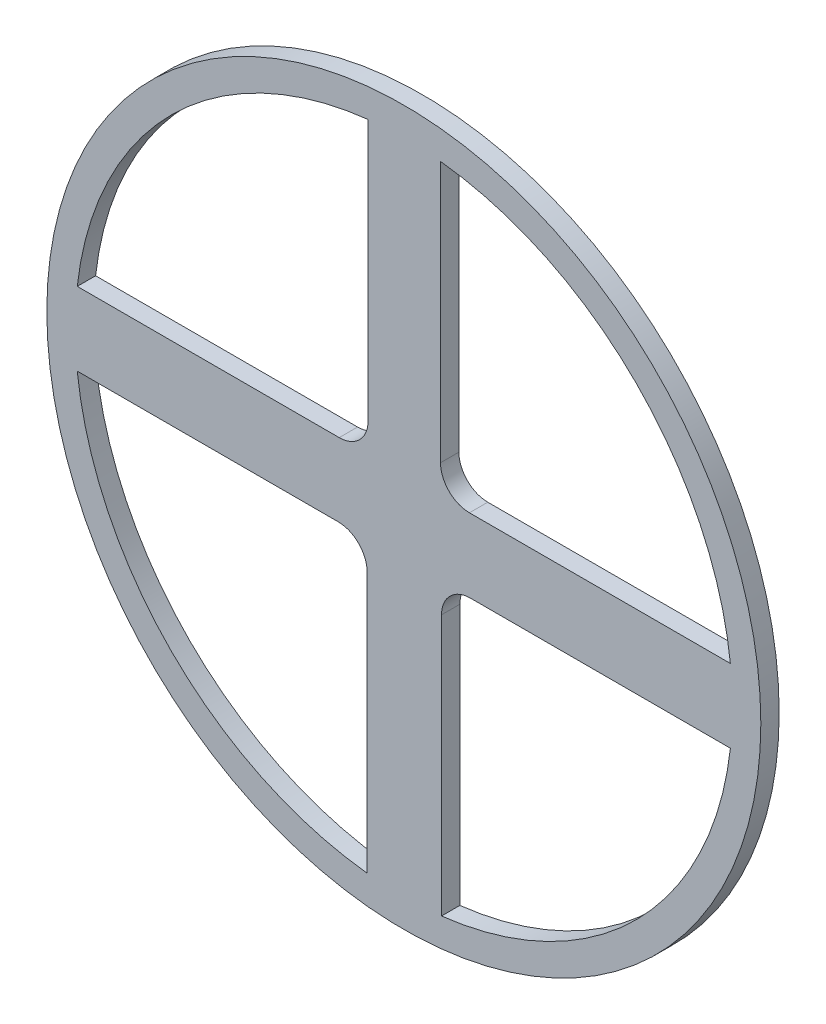
ISO-10303-21;
HEADER;
FILE_DESCRIPTION(('STEP AP214'),'2;1');
FILE_NAME('part.step','',(''),(''),'','','');
FILE_SCHEMA(('AUTOMOTIVE_DESIGN { 1 0 10303 214 1 1 1 1 }'));
ENDSEC;
DATA;
#1=APPLICATION_CONTEXT('core data for automotive mechanical design processes');
#2=APPLICATION_PROTOCOL_DEFINITION('international standard','automotive_design',2000,#1);
#3=PRODUCT_CONTEXT('',#1,'mechanical');
#4=PRODUCT('Part','Part','',(#3));
#5=PRODUCT_RELATED_PRODUCT_CATEGORY('part','',(#4));
#6=PRODUCT_DEFINITION_FORMATION('','',#4);
#7=PRODUCT_DEFINITION_CONTEXT('part definition',#1,'design');
#8=PRODUCT_DEFINITION('design','',#6,#7);
#9=PRODUCT_DEFINITION_SHAPE('','',#8);
#10=(LENGTH_UNIT() NAMED_UNIT(*) SI_UNIT(.MILLI.,.METRE.));
#11=(NAMED_UNIT(*) PLANE_ANGLE_UNIT() SI_UNIT($,.RADIAN.));
#12=(NAMED_UNIT(*) SI_UNIT($,.STERADIAN.) SOLID_ANGLE_UNIT());
#13=UNCERTAINTY_MEASURE_WITH_UNIT(LENGTH_MEASURE(1.E-05),#10,'distance_accuracy_value','');
#14=(GEOMETRIC_REPRESENTATION_CONTEXT(3) GLOBAL_UNCERTAINTY_ASSIGNED_CONTEXT((#13)) GLOBAL_UNIT_ASSIGNED_CONTEXT((#10,
#11,#12)) REPRESENTATION_CONTEXT('',''));
#15=CARTESIAN_POINT('',(0.,0.,0.));
#16=DIRECTION('',(0.,0.,1.));
#17=DIRECTION('',(1.,0.,0.));
#18=AXIS2_PLACEMENT_3D('',#15,#16,#17);
#19=CARTESIAN_POINT('',(0.,-12.7,6.35));
#20=DIRECTION('',(0.,1.,0.));
#21=DIRECTION('',(-1.,0.,0.));
#22=AXIS2_PLACEMENT_3D('',#19,#20,#21);
#23=PLANE('',#22);
#24=DIRECTION('',(1.,0.,0.));
#25=VECTOR('',#24,1.);
#26=CARTESIAN_POINT('',(0.,-12.7,0.));
#27=LINE('',#26,#25);
#28=CARTESIAN_POINT('',(23.0444472963723,-12.7,0.));
#29=VERTEX_POINT('',#28);
#30=CARTESIAN_POINT('',(112.9985579554,-12.7,0.));
#31=VERTEX_POINT('',#30);
#32=EDGE_CURVE('E223',#29,#31,#27,.T.);
#33=ORIENTED_EDGE('',*,*,#32,.T.);
#34=DIRECTION('',(0.,0.,-1.));
#35=VECTOR('',#34,1.);
#36=CARTESIAN_POINT('',(112.9985579554,-12.7,6.35));
#37=LINE('',#36,#35);
#38=CARTESIAN_POINT('',(112.9985579554,-12.7,6.35));
#39=VERTEX_POINT('',#38);
#40=EDGE_CURVE('E11',#39,#31,#37,.T.);
#41=ORIENTED_EDGE('',*,*,#40,.F.);
#42=DIRECTION('',(1.,0.,0.));
#43=VECTOR('',#42,1.);
#44=CARTESIAN_POINT('',(0.,-12.7,6.35));
#45=LINE('',#44,#43);
#46=CARTESIAN_POINT('',(23.0444472963723,-12.7,6.35));
#47=VERTEX_POINT('',#46);
#48=EDGE_CURVE('E177',#47,#39,#45,.T.);
#49=ORIENTED_EDGE('',*,*,#48,.F.);
#50=DIRECTION('',(0.,0.,-1.));
#51=VECTOR('',#50,1.);
#52=CARTESIAN_POINT('',(23.0444472963723,-12.7,6.35));
#53=LINE('',#52,#51);
#54=EDGE_CURVE('E232',#47,#29,#53,.T.);
#55=ORIENTED_EDGE('',*,*,#54,.T.);
#56=EDGE_LOOP('',(#33,#41,#49,#55));
#57=FACE_BOUND('',#56,.T.);
#58=ADVANCED_FACE('F43',(#57),#23,.F.);
#59=CARTESIAN_POINT('',(0.,0.,6.35));
#60=DIRECTION('',(0.,0.,-1.));
#61=DIRECTION('',(-1.,0.,0.));
#62=AXIS2_PLACEMENT_3D('',#59,#60,#61);
#63=CYLINDRICAL_SURFACE('',#62,113.71);
#64=CARTESIAN_POINT('',(0.,0.,0.));
#65=DIRECTION('',(0.,0.,1.));
#66=DIRECTION('',(1.,0.,0.));
#67=AXIS2_PLACEMENT_3D('',#64,#65,#66);
#68=CIRCLE('',#67,113.71);
#69=CARTESIAN_POINT('',(13.0444472963723,-112.959313448392,0.));
#70=VERTEX_POINT('',#69);
#71=EDGE_CURVE('E167',#70,#31,#68,.T.);
#72=ORIENTED_EDGE('',*,*,#71,.F.);
#73=DIRECTION('',(0.,0.,-1.));
#74=VECTOR('',#73,1.);
#75=CARTESIAN_POINT('',(13.0444472963723,-112.959313448392,6.35));
#76=LINE('',#75,#74);
#77=CARTESIAN_POINT('',(13.0444472963723,-112.959313448392,6.35));
#78=VERTEX_POINT('',#77);
#79=EDGE_CURVE('E53',#78,#70,#76,.T.);
#80=ORIENTED_EDGE('',*,*,#79,.F.);
#81=CARTESIAN_POINT('',(0.,0.,6.35));
#82=DIRECTION('',(0.,0.,1.));
#83=DIRECTION('',(1.,0.,0.));
#84=AXIS2_PLACEMENT_3D('',#81,#82,#83);
#85=CIRCLE('',#84,113.71);
#86=EDGE_CURVE('E165',#78,#39,#85,.T.);
#87=ORIENTED_EDGE('',*,*,#86,.T.);
#88=ORIENTED_EDGE('',*,*,#40,.T.);
#89=EDGE_LOOP('',(#72,#80,#87,#88));
#90=FACE_BOUND('',#89,.T.);
#91=ADVANCED_FACE('F164',(#90),#63,.F.);
#92=CARTESIAN_POINT('',(13.0444472963723,0.,6.35));
#93=DIRECTION('',(1.,0.,0.));
#94=DIRECTION('',(0.,1.,0.));
#95=AXIS2_PLACEMENT_3D('',#92,#93,#94);
#96=PLANE('',#95);
#97=DIRECTION('',(0.,-1.,0.));
#98=VECTOR('',#97,1.);
#99=CARTESIAN_POINT('',(13.0444472963723,0.,0.));
#100=LINE('',#99,#98);
#101=CARTESIAN_POINT('',(13.0444472963723,-22.7,0.));
#102=VERTEX_POINT('',#101);
#103=EDGE_CURVE('E226',#102,#70,#100,.T.);
#104=ORIENTED_EDGE('',*,*,#103,.F.);
#105=DIRECTION('',(0.,0.,-1.));
#106=VECTOR('',#105,1.);
#107=CARTESIAN_POINT('',(13.0444472963723,-22.7,6.35));
#108=LINE('',#107,#106);
#109=CARTESIAN_POINT('',(13.0444472963723,-22.7,6.35));
#110=VERTEX_POINT('',#109);
#111=EDGE_CURVE('E113',#110,#102,#108,.T.);
#112=ORIENTED_EDGE('',*,*,#111,.F.);
#113=DIRECTION('',(0.,-1.,0.));
#114=VECTOR('',#113,1.);
#115=CARTESIAN_POINT('',(13.0444472963723,0.,6.35));
#116=LINE('',#115,#114);
#117=EDGE_CURVE('E175',#110,#78,#116,.T.);
#118=ORIENTED_EDGE('',*,*,#117,.T.);
#119=ORIENTED_EDGE('',*,*,#79,.T.);
#120=EDGE_LOOP('',(#104,#112,#118,#119));
#121=FACE_BOUND('',#120,.T.);
#122=ADVANCED_FACE('F182',(#121),#96,.T.);
#123=CARTESIAN_POINT('',(-112.9985579554,-12.7,0.));
#124=VERTEX_POINT('',#123);
#125=CARTESIAN_POINT('',(-12.7,-112.9985579554,0.));
#126=VERTEX_POINT('',#125);
#127=EDGE_CURVE('E213',#124,#126,#68,.T.);
#128=ORIENTED_EDGE('',*,*,#127,.F.);
#129=DIRECTION('',(0.,0.,-1.));
#130=VECTOR('',#129,1.);
#131=CARTESIAN_POINT('',(-112.9985579554,-12.7,6.35));
#132=LINE('',#131,#130);
#133=CARTESIAN_POINT('',(-112.9985579554,-12.7,6.35));
#134=VERTEX_POINT('',#133);
#135=EDGE_CURVE('E234',#134,#124,#132,.T.);
#136=ORIENTED_EDGE('',*,*,#135,.F.);
#137=CARTESIAN_POINT('',(-12.7,-112.9985579554,6.35));
#138=VERTEX_POINT('',#137);
#139=EDGE_CURVE('E180',#134,#138,#85,.T.);
#140=ORIENTED_EDGE('',*,*,#139,.T.);
#141=DIRECTION('',(0.,0.,-1.));
#142=VECTOR('',#141,1.);
#143=CARTESIAN_POINT('',(-12.7,-112.9985579554,6.35));
#144=LINE('',#143,#142);
#145=EDGE_CURVE('E236',#138,#126,#144,.T.);
#146=ORIENTED_EDGE('',*,*,#145,.T.);
#147=EDGE_LOOP('',(#128,#136,#140,#146));
#148=FACE_BOUND('',#147,.T.);
#149=ADVANCED_FACE('F308',(#148),#63,.F.);
#150=CARTESIAN_POINT('',(0.,-12.7,6.35));
#151=DIRECTION('',(0.,1.,0.));
#152=DIRECTION('',(0.,0.,1.));
#153=AXIS2_PLACEMENT_3D('',#150,#151,#152);
#154=PLANE('',#153);
#155=DIRECTION('',(1.,0.,0.));
#156=VECTOR('',#155,1.);
#157=CARTESIAN_POINT('',(0.,-12.7,0.));
#158=LINE('',#157,#156);
#159=CARTESIAN_POINT('',(-22.7000000000001,-12.7,0.));
#160=VERTEX_POINT('',#159);
#161=EDGE_CURVE('E214',#124,#160,#158,.T.);
#162=ORIENTED_EDGE('',*,*,#161,.T.);
#163=DIRECTION('',(0.,0.,-1.));
#164=VECTOR('',#163,1.);
#165=CARTESIAN_POINT('',(-22.7000000000001,-12.7,6.35));
#166=LINE('',#165,#164);
#167=CARTESIAN_POINT('',(-22.7000000000001,-12.7,6.35));
#168=VERTEX_POINT('',#167);
#169=EDGE_CURVE('E241',#168,#160,#166,.T.);
#170=ORIENTED_EDGE('',*,*,#169,.F.);
#171=DIRECTION('',(1.,0.,0.));
#172=VECTOR('',#171,1.);
#173=CARTESIAN_POINT('',(0.,-12.7,6.35));
#174=LINE('',#173,#172);
#175=EDGE_CURVE('E291',#134,#168,#174,.T.);
#176=ORIENTED_EDGE('',*,*,#175,.F.);
#177=ORIENTED_EDGE('',*,*,#135,.T.);
#178=EDGE_LOOP('',(#162,#170,#176,#177));
#179=FACE_BOUND('',#178,.T.);
#180=ADVANCED_FACE('F358',(#179),#154,.F.);
#181=CARTESIAN_POINT('',(-22.7,-22.7,6.35));
#182=DIRECTION('',(0.,0.,-1.));
#183=DIRECTION('',(-1.,0.,0.));
#184=AXIS2_PLACEMENT_3D('',#181,#182,#183);
#185=CYLINDRICAL_SURFACE('',#184,10.);
#186=CARTESIAN_POINT('',(-22.7,-22.7,0.));
#187=DIRECTION('',(0.,0.,1.));
#188=DIRECTION('',(1.,0.,0.));
#189=AXIS2_PLACEMENT_3D('',#186,#187,#188);
#190=CIRCLE('',#189,10.);
#191=CARTESIAN_POINT('',(-12.7,-22.7000000000001,0.));
#192=VERTEX_POINT('',#191);
#193=EDGE_CURVE('E217',#192,#160,#190,.T.);
#194=ORIENTED_EDGE('',*,*,#193,.F.);
#195=DIRECTION('',(0.,0.,-1.));
#196=VECTOR('',#195,1.);
#197=CARTESIAN_POINT('',(-12.7,-22.7000000000001,6.35));
#198=LINE('',#197,#196);
#199=CARTESIAN_POINT('',(-12.7,-22.7000000000001,6.35));
#200=VERTEX_POINT('',#199);
#201=EDGE_CURVE('E238',#200,#192,#198,.T.);
#202=ORIENTED_EDGE('',*,*,#201,.F.);
#203=CARTESIAN_POINT('',(-22.7,-22.7,6.35));
#204=DIRECTION('',(0.,0.,1.));
#205=DIRECTION('',(1.,0.,0.));
#206=AXIS2_PLACEMENT_3D('',#203,#204,#205);
#207=CIRCLE('',#206,10.);
#208=EDGE_CURVE('E293',#200,#168,#207,.T.);
#209=ORIENTED_EDGE('',*,*,#208,.T.);
#210=ORIENTED_EDGE('',*,*,#169,.T.);
#211=EDGE_LOOP('',(#194,#202,#209,#210));
#212=FACE_BOUND('',#211,.T.);
#213=ADVANCED_FACE('F355',(#212),#185,.F.);
#214=CARTESIAN_POINT('',(-12.3555527036276,113.03673923724,0.));
#215=VERTEX_POINT('',#214);
#216=CARTESIAN_POINT('',(-112.9985579554,12.7,0.));
#217=VERTEX_POINT('',#216);
#218=EDGE_CURVE('E196',#215,#217,#68,.T.);
#219=ORIENTED_EDGE('',*,*,#218,.F.);
#220=DIRECTION('',(0.,0.,-1.));
#221=VECTOR('',#220,1.);
#222=CARTESIAN_POINT('',(-12.3555527036276,113.03673923724,6.35));
#223=LINE('',#222,#221);
#224=CARTESIAN_POINT('',(-12.3555527036276,113.03673923724,6.35));
#225=VERTEX_POINT('',#224);
#226=EDGE_CURVE('E239',#225,#215,#223,.T.);
#227=ORIENTED_EDGE('',*,*,#226,.F.);
#228=CARTESIAN_POINT('',(-112.9985579554,12.7,6.35));
#229=VERTEX_POINT('',#228);
#230=EDGE_CURVE('E276',#225,#229,#85,.T.);
#231=ORIENTED_EDGE('',*,*,#230,.T.);
#232=DIRECTION('',(0.,0.,-1.));
#233=VECTOR('',#232,1.);
#234=CARTESIAN_POINT('',(-112.9985579554,12.7,6.35));
#235=LINE('',#234,#233);
#236=EDGE_CURVE('E244',#229,#217,#235,.T.);
#237=ORIENTED_EDGE('',*,*,#236,.T.);
#238=EDGE_LOOP('',(#219,#227,#231,#237));
#239=FACE_BOUND('',#238,.T.);
#240=ADVANCED_FACE('F331',(#239),#63,.F.);
#241=CARTESIAN_POINT('',(-12.3555527036276,0.,6.35));
#242=DIRECTION('',(-1.,0.,0.));
#243=DIRECTION('',(0.,-1.,0.));
#244=AXIS2_PLACEMENT_3D('',#241,#242,#243);
#245=PLANE('',#244);
#246=DIRECTION('',(0.,1.,0.));
#247=VECTOR('',#246,1.);
#248=CARTESIAN_POINT('',(-12.3555527036276,0.,0.));
#249=LINE('',#248,#247);
#250=CARTESIAN_POINT('',(-12.3555527036276,22.7,0.));
#251=VERTEX_POINT('',#250);
#252=EDGE_CURVE('E204',#251,#215,#249,.T.);
#253=ORIENTED_EDGE('',*,*,#252,.F.);
#254=DIRECTION('',(0.,0.,-1.));
#255=VECTOR('',#254,1.);
#256=CARTESIAN_POINT('',(-12.3555527036276,22.7,6.35));
#257=LINE('',#256,#255);
#258=CARTESIAN_POINT('',(-12.3555527036276,22.7,6.35));
#259=VERTEX_POINT('',#258);
#260=EDGE_CURVE('E248',#259,#251,#257,.T.);
#261=ORIENTED_EDGE('',*,*,#260,.F.);
#262=DIRECTION('',(0.,1.,0.));
#263=VECTOR('',#262,1.);
#264=CARTESIAN_POINT('',(-12.3555527036276,0.,6.35));
#265=LINE('',#264,#263);
#266=EDGE_CURVE('E280',#259,#225,#265,.T.);
#267=ORIENTED_EDGE('',*,*,#266,.T.);
#268=ORIENTED_EDGE('',*,*,#226,.T.);
#269=EDGE_LOOP('',(#253,#261,#267,#268));
#270=FACE_BOUND('',#269,.T.);
#271=ADVANCED_FACE('F320',(#270),#245,.T.);
#272=CARTESIAN_POINT('',(-22.3555527036277,22.7,6.35));
#273=DIRECTION('',(0.,0.,-1.));
#274=DIRECTION('',(-1.,0.,0.));
#275=AXIS2_PLACEMENT_3D('',#272,#273,#274);
#276=CYLINDRICAL_SURFACE('',#275,10.);
#277=CARTESIAN_POINT('',(-22.3555527036277,22.7,0.));
#278=DIRECTION('',(0.,0.,1.));
#279=DIRECTION('',(1.,0.,0.));
#280=AXIS2_PLACEMENT_3D('',#277,#278,#279);
#281=CIRCLE('',#280,10.);
#282=CARTESIAN_POINT('',(-22.3555527036277,12.7,0.));
#283=VERTEX_POINT('',#282);
#284=EDGE_CURVE('E207',#251,#283,#281,.F.);
#285=ORIENTED_EDGE('',*,*,#284,.T.);
#286=DIRECTION('',(0.,0.,-1.));
#287=VECTOR('',#286,1.);
#288=CARTESIAN_POINT('',(-22.3555527036277,12.7,6.35));
#289=LINE('',#288,#287);
#290=CARTESIAN_POINT('',(-22.3555527036277,12.7,6.35));
#291=VERTEX_POINT('',#290);
#292=EDGE_CURVE('E246',#291,#283,#289,.T.);
#293=ORIENTED_EDGE('',*,*,#292,.F.);
#294=CARTESIAN_POINT('',(-22.3555527036277,22.7,6.35));
#295=DIRECTION('',(0.,0.,1.));
#296=DIRECTION('',(1.,0.,0.));
#297=AXIS2_PLACEMENT_3D('',#294,#295,#296);
#298=CIRCLE('',#297,10.);
#299=EDGE_CURVE('E286',#259,#291,#298,.F.);
#300=ORIENTED_EDGE('',*,*,#299,.F.);
#301=ORIENTED_EDGE('',*,*,#260,.T.);
#302=EDGE_LOOP('',(#285,#293,#300,#301));
#303=FACE_BOUND('',#302,.T.);
#304=ADVANCED_FACE('F326',(#303),#276,.F.);
#305=CARTESIAN_POINT('',(112.9985579554,12.7,0.));
#306=VERTEX_POINT('',#305);
#307=CARTESIAN_POINT('',(12.7,112.9985579554,0.));
#308=VERTEX_POINT('',#307);
#309=EDGE_CURVE('E192',#306,#308,#68,.T.);
#310=ORIENTED_EDGE('',*,*,#309,.F.);
#311=DIRECTION('',(0.,0.,-1.));
#312=VECTOR('',#311,1.);
#313=CARTESIAN_POINT('',(112.9985579554,12.7,6.35));
#314=LINE('',#313,#312);
#315=CARTESIAN_POINT('',(112.9985579554,12.7,6.35));
#316=VERTEX_POINT('',#315);
#317=EDGE_CURVE('E47',#316,#306,#314,.T.);
#318=ORIENTED_EDGE('',*,*,#317,.F.);
#319=CARTESIAN_POINT('',(12.7,112.9985579554,6.35));
#320=VERTEX_POINT('',#319);
#321=EDGE_CURVE('E181',#316,#320,#85,.T.);
#322=ORIENTED_EDGE('',*,*,#321,.T.);
#323=DIRECTION('',(0.,0.,-1.));
#324=VECTOR('',#323,1.);
#325=CARTESIAN_POINT('',(12.7,112.9985579554,6.35));
#326=LINE('',#325,#324);
#327=EDGE_CURVE('E191',#320,#308,#326,.T.);
#328=ORIENTED_EDGE('',*,*,#327,.T.);
#329=EDGE_LOOP('',(#310,#318,#322,#328));
#330=FACE_BOUND('',#329,.T.);
#331=ADVANCED_FACE('F263',(#330),#63,.F.);
#332=CARTESIAN_POINT('',(0.,12.7,6.35));
#333=DIRECTION('',(0.,1.,0.));
#334=DIRECTION('',(-1.,0.,0.));
#335=AXIS2_PLACEMENT_3D('',#332,#333,#334);
#336=PLANE('',#335);
#337=DIRECTION('',(1.,0.,0.));
#338=VECTOR('',#337,1.);
#339=CARTESIAN_POINT('',(0.,12.7,0.));
#340=LINE('',#339,#338);
#341=CARTESIAN_POINT('',(22.7000000000001,12.7,0.));
#342=VERTEX_POINT('',#341);
#343=EDGE_CURVE('E195',#342,#306,#340,.T.);
#344=ORIENTED_EDGE('',*,*,#343,.F.);
#345=DIRECTION('',(0.,0.,-1.));
#346=VECTOR('',#345,1.);
#347=CARTESIAN_POINT('',(22.7000000000001,12.7,6.35));
#348=LINE('',#347,#346);
#349=CARTESIAN_POINT('',(22.7000000000001,12.7,6.35));
#350=VERTEX_POINT('',#349);
#351=EDGE_CURVE('E254',#350,#342,#348,.T.);
#352=ORIENTED_EDGE('',*,*,#351,.F.);
#353=DIRECTION('',(1.,0.,0.));
#354=VECTOR('',#353,1.);
#355=CARTESIAN_POINT('',(0.,12.7,6.35));
#356=LINE('',#355,#354);
#357=EDGE_CURVE('E262',#350,#316,#356,.T.);
#358=ORIENTED_EDGE('',*,*,#357,.T.);
#359=ORIENTED_EDGE('',*,*,#317,.T.);
#360=EDGE_LOOP('',(#344,#352,#358,#359));
#361=FACE_BOUND('',#360,.T.);
#362=ADVANCED_FACE('F45',(#361),#336,.T.);
#363=CARTESIAN_POINT('',(22.7,22.7,6.35));
#364=DIRECTION('',(0.,0.,-1.));
#365=DIRECTION('',(-1.,0.,0.));
#366=AXIS2_PLACEMENT_3D('',#363,#364,#365);
#367=CYLINDRICAL_SURFACE('',#366,10.);
#368=CARTESIAN_POINT('',(22.7,22.7,0.));
#369=DIRECTION('',(0.,0.,1.));
#370=DIRECTION('',(1.,0.,0.));
#371=AXIS2_PLACEMENT_3D('',#368,#369,#370);
#372=CIRCLE('',#371,10.);
#373=CARTESIAN_POINT('',(12.7,22.7000000000001,0.));
#374=VERTEX_POINT('',#373);
#375=EDGE_CURVE('E199',#342,#374,#372,.F.);
#376=ORIENTED_EDGE('',*,*,#375,.T.);
#377=DIRECTION('',(0.,0.,-1.));
#378=VECTOR('',#377,1.);
#379=CARTESIAN_POINT('',(12.7,22.7000000000001,6.35));
#380=LINE('',#379,#378);
#381=CARTESIAN_POINT('',(12.7,22.7000000000001,6.35));
#382=VERTEX_POINT('',#381);
#383=EDGE_CURVE('E252',#382,#374,#380,.T.);
#384=ORIENTED_EDGE('',*,*,#383,.F.);
#385=CARTESIAN_POINT('',(22.7,22.7,6.35));
#386=DIRECTION('',(0.,0.,1.));
#387=DIRECTION('',(1.,0.,0.));
#388=AXIS2_PLACEMENT_3D('',#385,#386,#387);
#389=CIRCLE('',#388,10.);
#390=EDGE_CURVE('E277',#350,#382,#389,.F.);
#391=ORIENTED_EDGE('',*,*,#390,.F.);
#392=ORIENTED_EDGE('',*,*,#351,.T.);
#393=EDGE_LOOP('',(#376,#384,#391,#392));
#394=FACE_BOUND('',#393,.T.);
#395=ADVANCED_FACE('F270',(#394),#367,.F.);
#396=CARTESIAN_POINT('',(23.0444472963723,-22.7,6.35));
#397=DIRECTION('',(0.,0.,-1.));
#398=DIRECTION('',(-1.,0.,0.));
#399=AXIS2_PLACEMENT_3D('',#396,#397,#398);
#400=CYLINDRICAL_SURFACE('',#399,10.);
#401=CARTESIAN_POINT('',(23.0444472963723,-22.7,0.));
#402=DIRECTION('',(0.,0.,1.));
#403=DIRECTION('',(1.,0.,0.));
#404=AXIS2_PLACEMENT_3D('',#401,#402,#403);
#405=CIRCLE('',#404,10.);
#406=EDGE_CURVE('E116',#102,#29,#405,.F.);
#407=ORIENTED_EDGE('',*,*,#406,.T.);
#408=ORIENTED_EDGE('',*,*,#54,.F.);
#409=CARTESIAN_POINT('',(23.0444472963723,-22.7,6.35));
#410=DIRECTION('',(0.,0.,1.));
#411=DIRECTION('',(1.,0.,0.));
#412=AXIS2_PLACEMENT_3D('',#409,#410,#411);
#413=CIRCLE('',#412,10.);
#414=EDGE_CURVE('E62',#110,#47,#413,.F.);
#415=ORIENTED_EDGE('',*,*,#414,.F.);
#416=ORIENTED_EDGE('',*,*,#111,.T.);
#417=EDGE_LOOP('',(#407,#408,#415,#416));
#418=FACE_BOUND('',#417,.T.);
#419=ADVANCED_FACE('F338',(#418),#400,.F.);
#420=CARTESIAN_POINT('',(-12.7,0.,6.35));
#421=DIRECTION('',(1.,0.,0.));
#422=DIRECTION('',(0.,1.,0.));
#423=AXIS2_PLACEMENT_3D('',#420,#421,#422);
#424=PLANE('',#423);
#425=DIRECTION('',(0.,-1.,0.));
#426=VECTOR('',#425,1.);
#427=CARTESIAN_POINT('',(-12.7,0.,0.));
#428=LINE('',#427,#426);
#429=EDGE_CURVE('E220',#192,#126,#428,.T.);
#430=ORIENTED_EDGE('',*,*,#429,.T.);
#431=ORIENTED_EDGE('',*,*,#145,.F.);
#432=DIRECTION('',(0.,-1.,0.));
#433=VECTOR('',#432,1.);
#434=CARTESIAN_POINT('',(-12.7,0.,6.35));
#435=LINE('',#434,#433);
#436=EDGE_CURVE('E295',#200,#138,#435,.T.);
#437=ORIENTED_EDGE('',*,*,#436,.F.);
#438=ORIENTED_EDGE('',*,*,#201,.T.);
#439=EDGE_LOOP('',(#430,#431,#437,#438));
#440=FACE_BOUND('',#439,.T.);
#441=ADVANCED_FACE('F303',(#440),#424,.F.);
#442=CARTESIAN_POINT('',(0.,12.7,6.35));
#443=DIRECTION('',(0.,1.,0.));
#444=DIRECTION('',(-1.,0.,0.));
#445=AXIS2_PLACEMENT_3D('',#442,#443,#444);
#446=PLANE('',#445);
#447=DIRECTION('',(1.,0.,0.));
#448=VECTOR('',#447,1.);
#449=CARTESIAN_POINT('',(0.,12.7,0.));
#450=LINE('',#449,#448);
#451=EDGE_CURVE('E210',#217,#283,#450,.T.);
#452=ORIENTED_EDGE('',*,*,#451,.F.);
#453=ORIENTED_EDGE('',*,*,#236,.F.);
#454=DIRECTION('',(1.,0.,0.));
#455=VECTOR('',#454,1.);
#456=CARTESIAN_POINT('',(0.,12.7,6.35));
#457=LINE('',#456,#455);
#458=EDGE_CURVE('E288',#229,#291,#457,.T.);
#459=ORIENTED_EDGE('',*,*,#458,.T.);
#460=ORIENTED_EDGE('',*,*,#292,.T.);
#461=EDGE_LOOP('',(#452,#453,#459,#460));
#462=FACE_BOUND('',#461,.T.);
#463=ADVANCED_FACE('F329',(#462),#446,.T.);
#464=CARTESIAN_POINT('',(12.7,0.,6.35));
#465=DIRECTION('',(-1.,0.,0.));
#466=DIRECTION('',(0.,0.,1.));
#467=AXIS2_PLACEMENT_3D('',#464,#465,#466);
#468=PLANE('',#467);
#469=DIRECTION('',(0.,1.,0.));
#470=VECTOR('',#469,1.);
#471=CARTESIAN_POINT('',(12.7,0.,0.));
#472=LINE('',#471,#470);
#473=EDGE_CURVE('E201',#374,#308,#472,.T.);
#474=ORIENTED_EDGE('',*,*,#473,.T.);
#475=ORIENTED_EDGE('',*,*,#327,.F.);
#476=DIRECTION('',(0.,1.,0.));
#477=VECTOR('',#476,1.);
#478=CARTESIAN_POINT('',(12.7,0.,6.35));
#479=LINE('',#478,#477);
#480=EDGE_CURVE('E274',#382,#320,#479,.T.);
#481=ORIENTED_EDGE('',*,*,#480,.F.);
#482=ORIENTED_EDGE('',*,*,#383,.T.);
#483=EDGE_LOOP('',(#474,#475,#481,#482));
#484=FACE_BOUND('',#483,.T.);
#485=ADVANCED_FACE('F273',(#484),#468,.F.);
#486=CARTESIAN_POINT('',(0.,0.,6.35));
#487=DIRECTION('',(0.,0.,-1.));
#488=DIRECTION('',(-1.,0.,0.));
#489=AXIS2_PLACEMENT_3D('',#486,#487,#488);
#490=CYLINDRICAL_SURFACE('',#489,123.5325);
#491=CARTESIAN_POINT('',(0.,0.,6.35));
#492=DIRECTION('',(0.,0.,1.));
#493=DIRECTION('',(1.,0.,0.));
#494=AXIS2_PLACEMENT_3D('',#491,#492,#493);
#495=CIRCLE('',#494,123.5325);
#496=CARTESIAN_POINT('',(123.5325,0.,6.35));
#497=VERTEX_POINT('',#496);
#498=EDGE_CURVE('E184',#497,#497,#495,.T.);
#499=ORIENTED_EDGE('',*,*,#498,.F.);
#500=EDGE_LOOP('',(#499));
#501=FACE_BOUND('',#500,.T.);
#502=CARTESIAN_POINT('',(0.,0.,0.));
#503=DIRECTION('',(0.,0.,1.));
#504=DIRECTION('',(1.,0.,0.));
#505=AXIS2_PLACEMENT_3D('',#502,#503,#504);
#506=CIRCLE('',#505,123.5325);
#507=CARTESIAN_POINT('',(123.5325,0.,0.));
#508=VERTEX_POINT('',#507);
#509=EDGE_CURVE('E229',#508,#508,#506,.T.);
#510=ORIENTED_EDGE('',*,*,#509,.T.);
#511=EDGE_LOOP('',(#510));
#512=FACE_BOUND('',#511,.T.);
#513=ADVANCED_FACE('F312',(#501,#512),#490,.T.);
#514=CARTESIAN_POINT('',(0.,0.,6.35));
#515=DIRECTION('',(0.,0.,1.));
#516=DIRECTION('',(1.,0.,0.));
#517=AXIS2_PLACEMENT_3D('',#514,#515,#516);
#518=PLANE('',#517);
#519=ORIENTED_EDGE('',*,*,#321,.F.);
#520=ORIENTED_EDGE('',*,*,#357,.F.);
#521=ORIENTED_EDGE('',*,*,#390,.T.);
#522=ORIENTED_EDGE('',*,*,#480,.T.);
#523=EDGE_LOOP('',(#519,#520,#521,#522));
#524=FACE_BOUND('',#523,.T.);
#525=ORIENTED_EDGE('',*,*,#230,.F.);
#526=ORIENTED_EDGE('',*,*,#266,.F.);
#527=ORIENTED_EDGE('',*,*,#299,.T.);
#528=ORIENTED_EDGE('',*,*,#458,.F.);
#529=EDGE_LOOP('',(#525,#526,#527,#528));
#530=FACE_BOUND('',#529,.T.);
#531=ORIENTED_EDGE('',*,*,#139,.F.);
#532=ORIENTED_EDGE('',*,*,#175,.T.);
#533=ORIENTED_EDGE('',*,*,#208,.F.);
#534=ORIENTED_EDGE('',*,*,#436,.T.);
#535=EDGE_LOOP('',(#531,#532,#533,#534));
#536=FACE_BOUND('',#535,.T.);
#537=ORIENTED_EDGE('',*,*,#48,.T.);
#538=ORIENTED_EDGE('',*,*,#86,.F.);
#539=ORIENTED_EDGE('',*,*,#117,.F.);
#540=ORIENTED_EDGE('',*,*,#414,.T.);
#541=EDGE_LOOP('',(#537,#538,#539,#540));
#542=FACE_BOUND('',#541,.T.);
#543=ORIENTED_EDGE('',*,*,#498,.T.);
#544=EDGE_LOOP('',(#543));
#545=FACE_BOUND('',#544,.T.);
#546=ADVANCED_FACE('F173',(#524,#530,#536,#542,#545),#518,.T.);
#547=CARTESIAN_POINT('',(0.,0.,0.));
#548=DIRECTION('',(0.,0.,1.));
#549=DIRECTION('',(1.,0.,0.));
#550=AXIS2_PLACEMENT_3D('',#547,#548,#549);
#551=PLANE('',#550);
#552=ORIENTED_EDGE('',*,*,#309,.T.);
#553=ORIENTED_EDGE('',*,*,#473,.F.);
#554=ORIENTED_EDGE('',*,*,#375,.F.);
#555=ORIENTED_EDGE('',*,*,#343,.T.);
#556=EDGE_LOOP('',(#552,#553,#554,#555));
#557=FACE_BOUND('',#556,.T.);
#558=ORIENTED_EDGE('',*,*,#218,.T.);
#559=ORIENTED_EDGE('',*,*,#451,.T.);
#560=ORIENTED_EDGE('',*,*,#284,.F.);
#561=ORIENTED_EDGE('',*,*,#252,.T.);
#562=EDGE_LOOP('',(#558,#559,#560,#561));
#563=FACE_BOUND('',#562,.T.);
#564=ORIENTED_EDGE('',*,*,#127,.T.);
#565=ORIENTED_EDGE('',*,*,#429,.F.);
#566=ORIENTED_EDGE('',*,*,#193,.T.);
#567=ORIENTED_EDGE('',*,*,#161,.F.);
#568=EDGE_LOOP('',(#564,#565,#566,#567));
#569=FACE_BOUND('',#568,.T.);
#570=ORIENTED_EDGE('',*,*,#32,.F.);
#571=ORIENTED_EDGE('',*,*,#406,.F.);
#572=ORIENTED_EDGE('',*,*,#103,.T.);
#573=ORIENTED_EDGE('',*,*,#71,.T.);
#574=EDGE_LOOP('',(#570,#571,#572,#573));
#575=FACE_BOUND('',#574,.T.);
#576=ORIENTED_EDGE('',*,*,#509,.F.);
#577=EDGE_LOOP('',(#576));
#578=FACE_BOUND('',#577,.T.);
#579=ADVANCED_FACE('F267',(#557,#563,#569,#575,#578),#551,.F.);
#580=CLOSED_SHELL('',(#58,#91,#122,#149,#180,#213,#240,#271,#304,#331,#362,#395,#419,#441,#463,
#485,#513,#546,#579));
#581=MANIFOLD_SOLID_BREP('B2',#580);
#582=ADVANCED_BREP_SHAPE_REPRESENTATION('',(#18,#581),#14);
#583=SHAPE_DEFINITION_REPRESENTATION(#9,#582);
ENDSEC;
END-ISO-10303-21;
